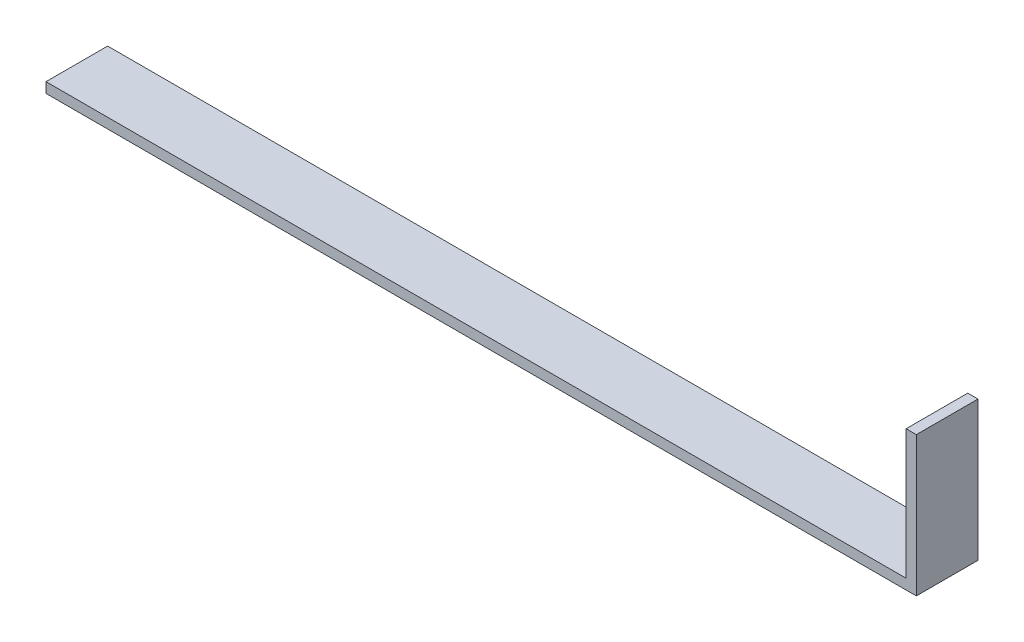
ISO-10303-21;
HEADER;
FILE_DESCRIPTION(('STEP AP214'),'2;1');
FILE_NAME('part.step','',(''),(''),'','','');
FILE_SCHEMA(('AUTOMOTIVE_DESIGN { 1 0 10303 214 1 1 1 1 }'));
ENDSEC;
DATA;
#1=APPLICATION_CONTEXT('core data for automotive mechanical design processes');
#2=APPLICATION_PROTOCOL_DEFINITION('international standard','automotive_design',2000,#1);
#3=PRODUCT_CONTEXT('',#1,'mechanical');
#4=PRODUCT('Part','Part','',(#3));
#5=PRODUCT_RELATED_PRODUCT_CATEGORY('part','',(#4));
#6=PRODUCT_DEFINITION_FORMATION('','',#4);
#7=PRODUCT_DEFINITION_CONTEXT('part definition',#1,'design');
#8=PRODUCT_DEFINITION('design','',#6,#7);
#9=PRODUCT_DEFINITION_SHAPE('','',#8);
#10=(LENGTH_UNIT() NAMED_UNIT(*) SI_UNIT(.MILLI.,.METRE.));
#11=(NAMED_UNIT(*) PLANE_ANGLE_UNIT() SI_UNIT($,.RADIAN.));
#12=(NAMED_UNIT(*) SI_UNIT($,.STERADIAN.) SOLID_ANGLE_UNIT());
#13=UNCERTAINTY_MEASURE_WITH_UNIT(LENGTH_MEASURE(1.E-05),#10,'distance_accuracy_value','');
#14=(GEOMETRIC_REPRESENTATION_CONTEXT(3) GLOBAL_UNCERTAINTY_ASSIGNED_CONTEXT((#13)) GLOBAL_UNIT_ASSIGNED_CONTEXT((#10,
#11,#12)) REPRESENTATION_CONTEXT('',''));
#15=CARTESIAN_POINT('',(0.,0.,0.));
#16=DIRECTION('',(0.,0.,1.));
#17=DIRECTION('',(1.,0.,0.));
#18=AXIS2_PLACEMENT_3D('',#15,#16,#17);
#19=CARTESIAN_POINT('',(0.,-6.31,38.1));
#20=DIRECTION('',(0.,1.,0.));
#21=DIRECTION('',(0.,0.,1.));
#22=AXIS2_PLACEMENT_3D('',#19,#20,#21);
#23=PLANE('',#22);
#24=DIRECTION('',(1.,0.,0.));
#25=VECTOR('',#24,1.);
#26=CARTESIAN_POINT('',(0.,-6.31,0.));
#27=LINE('',#26,#25);
#28=CARTESIAN_POINT('',(-328.45,-6.31,0.));
#29=VERTEX_POINT('',#28);
#30=CARTESIAN_POINT('',(209.247647511231,-6.31,0.));
#31=VERTEX_POINT('',#30);
#32=EDGE_CURVE('E98',#29,#31,#27,.T.);
#33=ORIENTED_EDGE('',*,*,#32,.T.);
#34=DIRECTION('',(0.,0.,-1.));
#35=VECTOR('',#34,1.);
#36=CARTESIAN_POINT('',(209.247647511231,-6.31,38.1));
#37=LINE('',#36,#35);
#38=CARTESIAN_POINT('',(209.247647511231,-6.31,38.1));
#39=VERTEX_POINT('',#38);
#40=EDGE_CURVE('E11',#39,#31,#37,.T.);
#41=ORIENTED_EDGE('',*,*,#40,.F.);
#42=DIRECTION('',(1.,0.,0.));
#43=VECTOR('',#42,1.);
#44=CARTESIAN_POINT('',(0.,-6.31,38.1));
#45=LINE('',#44,#43);
#46=CARTESIAN_POINT('',(-328.45,-6.31,38.1));
#47=VERTEX_POINT('',#46);
#48=EDGE_CURVE('E79',#47,#39,#45,.T.);
#49=ORIENTED_EDGE('',*,*,#48,.F.);
#50=DIRECTION('',(0.,0.,1.));
#51=VECTOR('',#50,1.);
#52=CARTESIAN_POINT('',(-328.45,-6.31,38.1));
#53=LINE('',#52,#51);
#54=EDGE_CURVE('E109',#29,#47,#53,.T.);
#55=ORIENTED_EDGE('',*,*,#54,.F.);
#56=EDGE_LOOP('',(#33,#41,#49,#55));
#57=FACE_BOUND('',#56,.T.);
#58=ADVANCED_FACE('F37',(#57),#23,.F.);
#59=CARTESIAN_POINT('',(209.247647511231,-6.31,38.1));
#60=DIRECTION('',(-1.,0.,0.));
#61=DIRECTION('',(0.,0.,1.));
#62=AXIS2_PLACEMENT_3D('',#59,#60,#61);
#63=PLANE('',#62);
#64=DIRECTION('',(0.,1.,0.));
#65=VECTOR('',#64,1.);
#66=CARTESIAN_POINT('',(209.247647511231,-6.31,0.));
#67=LINE('',#66,#65);
#68=CARTESIAN_POINT('',(209.247647511231,80.,0.));
#69=VERTEX_POINT('',#68);
#70=EDGE_CURVE('E104',#31,#69,#67,.T.);
#71=ORIENTED_EDGE('',*,*,#70,.T.);
#72=DIRECTION('',(0.,0.,-1.));
#73=VECTOR('',#72,1.);
#74=CARTESIAN_POINT('',(209.247647511231,80.,0.));
#75=LINE('',#74,#73);
#76=CARTESIAN_POINT('',(209.247647511231,80.,38.1));
#77=VERTEX_POINT('',#76);
#78=EDGE_CURVE('E106',#77,#69,#75,.T.);
#79=ORIENTED_EDGE('',*,*,#78,.F.);
#80=DIRECTION('',(0.,1.,0.));
#81=VECTOR('',#80,1.);
#82=CARTESIAN_POINT('',(209.247647511231,-6.31,38.1));
#83=LINE('',#82,#81);
#84=EDGE_CURVE('E124',#39,#77,#83,.T.);
#85=ORIENTED_EDGE('',*,*,#84,.F.);
#86=ORIENTED_EDGE('',*,*,#40,.T.);
#87=EDGE_LOOP('',(#71,#79,#85,#86));
#88=FACE_BOUND('',#87,.T.);
#89=ADVANCED_FACE('F155',(#88),#63,.F.);
#90=CARTESIAN_POINT('',(202.93764751123,80.,38.1));
#91=DIRECTION('',(0.,-1.,0.));
#92=DIRECTION('',(0.,0.,-1.));
#93=AXIS2_PLACEMENT_3D('',#90,#91,#92);
#94=PLANE('',#93);
#95=DIRECTION('',(-1.,0.,0.));
#96=VECTOR('',#95,1.);
#97=CARTESIAN_POINT('',(202.93764751123,80.,38.1));
#98=LINE('',#97,#96);
#99=CARTESIAN_POINT('',(202.93764751123,80.,38.1));
#100=VERTEX_POINT('',#99);
#101=EDGE_CURVE('E127',#77,#100,#98,.T.);
#102=ORIENTED_EDGE('',*,*,#101,.F.);
#103=ORIENTED_EDGE('',*,*,#78,.T.);
#104=DIRECTION('',(-1.,0.,0.));
#105=VECTOR('',#104,1.);
#106=CARTESIAN_POINT('',(202.93764751123,80.,0.));
#107=LINE('',#106,#105);
#108=CARTESIAN_POINT('',(202.93764751123,80.,0.));
#109=VERTEX_POINT('',#108);
#110=EDGE_CURVE('E68',#69,#109,#107,.T.);
#111=ORIENTED_EDGE('',*,*,#110,.T.);
#112=DIRECTION('',(0.,0.,-1.));
#113=VECTOR('',#112,1.);
#114=CARTESIAN_POINT('',(202.93764751123,80.,38.1));
#115=LINE('',#114,#113);
#116=EDGE_CURVE('E45',#100,#109,#115,.T.);
#117=ORIENTED_EDGE('',*,*,#116,.F.);
#118=EDGE_LOOP('',(#102,#103,#111,#117));
#119=FACE_BOUND('',#118,.T.);
#120=ADVANCED_FACE('F159',(#119),#94,.F.);
#121=CARTESIAN_POINT('',(202.93764751123,0.,38.1));
#122=DIRECTION('',(1.,0.,0.));
#123=DIRECTION('',(0.,0.,-1.));
#124=AXIS2_PLACEMENT_3D('',#121,#122,#123);
#125=PLANE('',#124);
#126=DIRECTION('',(0.,-1.,0.));
#127=VECTOR('',#126,1.);
#128=CARTESIAN_POINT('',(202.93764751123,0.,0.));
#129=LINE('',#128,#127);
#130=CARTESIAN_POINT('',(202.93764751123,0.,0.));
#131=VERTEX_POINT('',#130);
#132=EDGE_CURVE('E73',#109,#131,#129,.T.);
#133=ORIENTED_EDGE('',*,*,#132,.T.);
#134=DIRECTION('',(0.,0.,-1.));
#135=VECTOR('',#134,1.);
#136=CARTESIAN_POINT('',(202.93764751123,0.,38.1));
#137=LINE('',#136,#135);
#138=CARTESIAN_POINT('',(202.93764751123,0.,38.1));
#139=VERTEX_POINT('',#138);
#140=EDGE_CURVE('E131',#139,#131,#137,.T.);
#141=ORIENTED_EDGE('',*,*,#140,.F.);
#142=DIRECTION('',(0.,-1.,0.));
#143=VECTOR('',#142,1.);
#144=CARTESIAN_POINT('',(202.93764751123,0.,38.1));
#145=LINE('',#144,#143);
#146=EDGE_CURVE('E53',#100,#139,#145,.T.);
#147=ORIENTED_EDGE('',*,*,#146,.F.);
#148=ORIENTED_EDGE('',*,*,#116,.T.);
#149=EDGE_LOOP('',(#133,#141,#147,#148));
#150=FACE_BOUND('',#149,.T.);
#151=ADVANCED_FACE('F137',(#150),#125,.F.);
#152=CARTESIAN_POINT('',(0.,0.,38.1));
#153=DIRECTION('',(0.,-1.,0.));
#154=DIRECTION('',(0.,0.,-1.));
#155=AXIS2_PLACEMENT_3D('',#152,#153,#154);
#156=PLANE('',#155);
#157=DIRECTION('',(-1.,0.,0.));
#158=VECTOR('',#157,1.);
#159=CARTESIAN_POINT('',(0.,0.,0.));
#160=LINE('',#159,#158);
#161=CARTESIAN_POINT('',(-328.45,0.,0.));
#162=VERTEX_POINT('',#161);
#163=EDGE_CURVE('E125',#131,#162,#160,.T.);
#164=ORIENTED_EDGE('',*,*,#163,.T.);
#165=DIRECTION('',(0.,0.,-1.));
#166=VECTOR('',#165,1.);
#167=CARTESIAN_POINT('',(-328.45,0.,0.));
#168=LINE('',#167,#166);
#169=CARTESIAN_POINT('',(-328.45,0.,38.1));
#170=VERTEX_POINT('',#169);
#171=EDGE_CURVE('E117',#170,#162,#168,.T.);
#172=ORIENTED_EDGE('',*,*,#171,.F.);
#173=DIRECTION('',(-1.,0.,0.));
#174=VECTOR('',#173,1.);
#175=CARTESIAN_POINT('',(0.,0.,38.1));
#176=LINE('',#175,#174);
#177=EDGE_CURVE('E130',#139,#170,#176,.T.);
#178=ORIENTED_EDGE('',*,*,#177,.F.);
#179=ORIENTED_EDGE('',*,*,#140,.T.);
#180=EDGE_LOOP('',(#164,#172,#178,#179));
#181=FACE_BOUND('',#180,.T.);
#182=ADVANCED_FACE('F140',(#181),#156,.F.);
#183=CARTESIAN_POINT('',(0.,0.,38.1));
#184=DIRECTION('',(0.,0.,1.));
#185=DIRECTION('',(1.,0.,0.));
#186=AXIS2_PLACEMENT_3D('',#183,#184,#185);
#187=PLANE('',#186);
#188=ORIENTED_EDGE('',*,*,#84,.T.);
#189=ORIENTED_EDGE('',*,*,#101,.T.);
#190=ORIENTED_EDGE('',*,*,#146,.T.);
#191=ORIENTED_EDGE('',*,*,#177,.T.);
#192=DIRECTION('',(0.,1.,0.));
#193=VECTOR('',#192,1.);
#194=CARTESIAN_POINT('',(-328.45,0.,38.1));
#195=LINE('',#194,#193);
#196=EDGE_CURVE('E112',#47,#170,#195,.T.);
#197=ORIENTED_EDGE('',*,*,#196,.F.);
#198=ORIENTED_EDGE('',*,*,#48,.T.);
#199=EDGE_LOOP('',(#188,#189,#190,#191,#197,#198));
#200=FACE_BOUND('',#199,.T.);
#201=ADVANCED_FACE('F142',(#200),#187,.T.);
#202=CARTESIAN_POINT('',(0.,0.,0.));
#203=DIRECTION('',(0.,0.,1.));
#204=DIRECTION('',(1.,0.,0.));
#205=AXIS2_PLACEMENT_3D('',#202,#203,#204);
#206=PLANE('',#205);
#207=ORIENTED_EDGE('',*,*,#110,.F.);
#208=ORIENTED_EDGE('',*,*,#70,.F.);
#209=ORIENTED_EDGE('',*,*,#32,.F.);
#210=DIRECTION('',(0.,-1.,0.));
#211=VECTOR('',#210,1.);
#212=CARTESIAN_POINT('',(-328.45,-6.31,0.));
#213=LINE('',#212,#211);
#214=EDGE_CURVE('E103',#162,#29,#213,.T.);
#215=ORIENTED_EDGE('',*,*,#214,.F.);
#216=ORIENTED_EDGE('',*,*,#163,.F.);
#217=ORIENTED_EDGE('',*,*,#132,.F.);
#218=EDGE_LOOP('',(#207,#208,#209,#215,#216,#217));
#219=FACE_BOUND('',#218,.T.);
#220=ADVANCED_FACE('F100',(#219),#206,.F.);
#221=CARTESIAN_POINT('',(-328.45,0.,0.));
#222=DIRECTION('',(1.,0.,0.));
#223=DIRECTION('',(0.,0.,-1.));
#224=AXIS2_PLACEMENT_3D('',#221,#222,#223);
#225=PLANE('',#224);
#226=ORIENTED_EDGE('',*,*,#214,.T.);
#227=ORIENTED_EDGE('',*,*,#54,.T.);
#228=ORIENTED_EDGE('',*,*,#196,.T.);
#229=ORIENTED_EDGE('',*,*,#171,.T.);
#230=EDGE_LOOP('',(#226,#227,#228,#229));
#231=FACE_BOUND('',#230,.T.);
#232=ADVANCED_FACE('F115',(#231),#225,.F.);
#233=CLOSED_SHELL('',(#58,#89,#120,#151,#182,#201,#220,#232));
#234=MANIFOLD_SOLID_BREP('B2',#233);
#235=ADVANCED_BREP_SHAPE_REPRESENTATION('',(#18,#234),#14);
#236=SHAPE_DEFINITION_REPRESENTATION(#9,#235);
ENDSEC;
END-ISO-10303-21;
